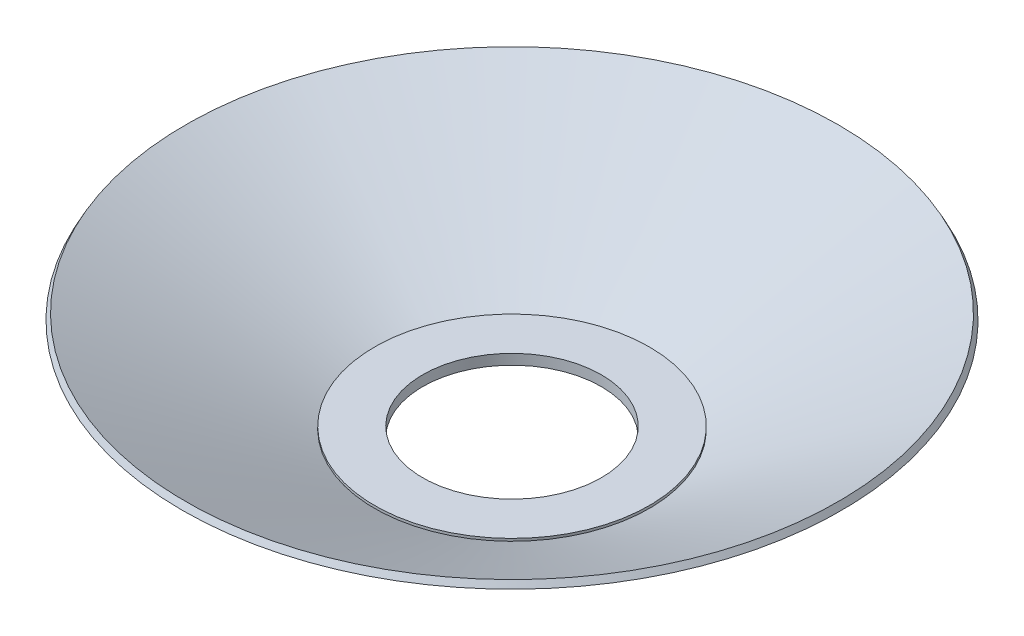
ISO-10303-21;
HEADER;
FILE_DESCRIPTION(('STEP AP214'),'2;1');
FILE_NAME('part.step','',(''),(''),'','','');
FILE_SCHEMA(('AUTOMOTIVE_DESIGN { 1 0 10303 214 1 1 1 1 }'));
ENDSEC;
DATA;
#1=APPLICATION_CONTEXT('core data for automotive mechanical design processes');
#2=APPLICATION_PROTOCOL_DEFINITION('international standard','automotive_design',2000,#1);
#3=PRODUCT_CONTEXT('',#1,'mechanical');
#4=PRODUCT('Part','Part','',(#3));
#5=PRODUCT_RELATED_PRODUCT_CATEGORY('part','',(#4));
#6=PRODUCT_DEFINITION_FORMATION('','',#4);
#7=PRODUCT_DEFINITION_CONTEXT('part definition',#1,'design');
#8=PRODUCT_DEFINITION('design','',#6,#7);
#9=PRODUCT_DEFINITION_SHAPE('','',#8);
#10=(LENGTH_UNIT() NAMED_UNIT(*) SI_UNIT(.MILLI.,.METRE.));
#11=(NAMED_UNIT(*) PLANE_ANGLE_UNIT() SI_UNIT($,.RADIAN.));
#12=(NAMED_UNIT(*) SI_UNIT($,.STERADIAN.) SOLID_ANGLE_UNIT());
#13=UNCERTAINTY_MEASURE_WITH_UNIT(LENGTH_MEASURE(1.E-05),#10,'distance_accuracy_value','');
#14=(GEOMETRIC_REPRESENTATION_CONTEXT(3) GLOBAL_UNCERTAINTY_ASSIGNED_CONTEXT((#13)) GLOBAL_UNIT_ASSIGNED_CONTEXT((#10,
#11,#12)) REPRESENTATION_CONTEXT('',''));
#15=CARTESIAN_POINT('',(0.,0.,0.));
#16=DIRECTION('',(0.,0.,1.));
#17=DIRECTION('',(1.,0.,0.));
#18=AXIS2_PLACEMENT_3D('',#15,#16,#17);
#19=CARTESIAN_POINT('',(0.,0.,0.));
#20=DIRECTION('',(0.,-1.,0.));
#21=DIRECTION('',(0.,0.,-1.));
#22=AXIS2_PLACEMENT_3D('',#19,#20,#21);
#23=CYLINDRICAL_SURFACE('',#22,20.);
#24=CARTESIAN_POINT('',(0.,0.,0.));
#25=DIRECTION('',(0.,-1.,0.));
#26=DIRECTION('',(0.,0.,-1.));
#27=AXIS2_PLACEMENT_3D('',#24,#25,#26);
#28=CIRCLE('',#27,20.);
#29=CARTESIAN_POINT('',(0.,0.,-20.));
#30=VERTEX_POINT('',#29);
#31=EDGE_CURVE('E59',#30,#30,#28,.T.);
#32=ORIENTED_EDGE('',*,*,#31,.T.);
#33=EDGE_LOOP('',(#32));
#34=FACE_BOUND('',#33,.T.);
#35=CARTESIAN_POINT('',(0.,-0.367429949310956,0.));
#36=DIRECTION('',(0.,-1.,0.));
#37=DIRECTION('',(0.,0.,-1.));
#38=AXIS2_PLACEMENT_3D('',#35,#36,#37);
#39=CIRCLE('',#38,20.);
#40=CARTESIAN_POINT('',(0.,-0.367429949310956,-20.));
#41=VERTEX_POINT('',#40);
#42=EDGE_CURVE('E10',#41,#41,#39,.T.);
#43=ORIENTED_EDGE('',*,*,#42,.F.);
#44=EDGE_LOOP('',(#43));
#45=FACE_BOUND('',#44,.T.);
#46=ADVANCED_FACE('F34',(#34,#45),#23,.T.);
#47=CARTESIAN_POINT('',(0.,14.2545794213797,0.));
#48=DIRECTION('',(0.,1.,0.));
#49=DIRECTION('',(0.,0.,1.));
#50=AXIS2_PLACEMENT_3D('',#47,#48,#49);
#51=CONICAL_SURFACE('',#50,47.5,1.08210413623648);
#52=ORIENTED_EDGE('',*,*,#42,.T.);
#53=EDGE_LOOP('',(#52));
#54=FACE_BOUND('',#53,.T.);
#55=CARTESIAN_POINT('',(0.,14.2545794213797,0.));
#56=DIRECTION('',(0.,-1.,0.));
#57=DIRECTION('',(0.,0.,-1.));
#58=AXIS2_PLACEMENT_3D('',#55,#56,#57);
#59=CIRCLE('',#58,47.5);
#60=CARTESIAN_POINT('',(0.,14.2545794213797,-47.5));
#61=VERTEX_POINT('',#60);
#62=EDGE_CURVE('E40',#61,#61,#59,.T.);
#63=ORIENTED_EDGE('',*,*,#62,.F.);
#64=EDGE_LOOP('',(#63));
#65=FACE_BOUND('',#64,.T.);
#66=ADVANCED_FACE('F77',(#54,#65),#51,.F.);
#67=CARTESIAN_POINT('',(0.,13.3716318285208,0.));
#68=DIRECTION('',(0.,-1.,0.));
#69=DIRECTION('',(0.,0.,-1.));
#70=AXIS2_PLACEMENT_3D('',#67,#68,#69);
#71=CONICAL_SURFACE('',#70,47.9694715627859,0.488692190558407);
#72=ORIENTED_EDGE('',*,*,#62,.T.);
#73=EDGE_LOOP('',(#72));
#74=FACE_BOUND('',#73,.T.);
#75=CARTESIAN_POINT('',(0.,13.3716318285208,0.));
#76=DIRECTION('',(0.,-1.,0.));
#77=DIRECTION('',(0.,0.,-1.));
#78=AXIS2_PLACEMENT_3D('',#75,#76,#77);
#79=CIRCLE('',#78,47.9694715627859);
#80=CARTESIAN_POINT('',(0.,13.3716318285208,-47.9694715627859));
#81=VERTEX_POINT('',#80);
#82=EDGE_CURVE('E44',#81,#81,#79,.T.);
#83=ORIENTED_EDGE('',*,*,#82,.F.);
#84=EDGE_LOOP('',(#83));
#85=FACE_BOUND('',#84,.T.);
#86=ADVANCED_FACE('F81',(#74,#85),#71,.T.);
#87=CARTESIAN_POINT('',(0.,-1.5,0.));
#88=DIRECTION('',(0.,1.,0.));
#89=DIRECTION('',(0.,0.,1.));
#90=AXIS2_PLACEMENT_3D('',#87,#88,#89);
#91=CONICAL_SURFACE('',#90,20.,1.08210413623648);
#92=ORIENTED_EDGE('',*,*,#82,.T.);
#93=EDGE_LOOP('',(#92));
#94=FACE_BOUND('',#93,.T.);
#95=CARTESIAN_POINT('',(0.,-1.5,0.));
#96=DIRECTION('',(0.,-1.,0.));
#97=DIRECTION('',(0.,0.,-1.));
#98=AXIS2_PLACEMENT_3D('',#95,#96,#97);
#99=CIRCLE('',#98,20.);
#100=CARTESIAN_POINT('',(0.,-1.5,-20.));
#101=VERTEX_POINT('',#100);
#102=EDGE_CURVE('E48',#101,#101,#99,.T.);
#103=ORIENTED_EDGE('',*,*,#102,.F.);
#104=EDGE_LOOP('',(#103));
#105=FACE_BOUND('',#104,.T.);
#106=ADVANCED_FACE('F85',(#94,#105),#91,.T.);
#107=CARTESIAN_POINT('',(20.,-1.5,0.));
#108=DIRECTION('',(0.,-1.,0.));
#109=DIRECTION('',(0.,0.,-1.));
#110=AXIS2_PLACEMENT_3D('',#107,#108,#109);
#111=PLANE('',#110);
#112=ORIENTED_EDGE('',*,*,#102,.T.);
#113=EDGE_LOOP('',(#112));
#114=FACE_BOUND('',#113,.T.);
#115=CARTESIAN_POINT('',(0.,-1.5,0.));
#116=DIRECTION('',(0.,-1.,0.));
#117=DIRECTION('',(0.,0.,-1.));
#118=AXIS2_PLACEMENT_3D('',#115,#116,#117);
#119=CIRCLE('',#118,13.);
#120=CARTESIAN_POINT('',(0.,-1.5,-13.));
#121=VERTEX_POINT('',#120);
#122=EDGE_CURVE('E53',#121,#121,#119,.T.);
#123=ORIENTED_EDGE('',*,*,#122,.F.);
#124=EDGE_LOOP('',(#123));
#125=FACE_BOUND('',#124,.T.);
#126=ADVANCED_FACE('F73',(#114,#125),#111,.T.);
#127=CARTESIAN_POINT('',(0.,0.,0.));
#128=DIRECTION('',(0.,-1.,0.));
#129=DIRECTION('',(0.,0.,-1.));
#130=AXIS2_PLACEMENT_3D('',#127,#128,#129);
#131=CYLINDRICAL_SURFACE('',#130,13.);
#132=ORIENTED_EDGE('',*,*,#122,.T.);
#133=EDGE_LOOP('',(#132));
#134=FACE_BOUND('',#133,.T.);
#135=CARTESIAN_POINT('',(0.,0.,0.));
#136=DIRECTION('',(0.,-1.,0.));
#137=DIRECTION('',(0.,0.,-1.));
#138=AXIS2_PLACEMENT_3D('',#135,#136,#137);
#139=CIRCLE('',#138,13.);
#140=CARTESIAN_POINT('',(0.,0.,-13.));
#141=VERTEX_POINT('',#140);
#142=EDGE_CURVE('E56',#141,#141,#139,.T.);
#143=ORIENTED_EDGE('',*,*,#142,.F.);
#144=EDGE_LOOP('',(#143));
#145=FACE_BOUND('',#144,.T.);
#146=ADVANCED_FACE('F67',(#134,#145),#131,.F.);
#147=CARTESIAN_POINT('',(13.,0.,0.));
#148=DIRECTION('',(0.,1.,0.));
#149=DIRECTION('',(0.,0.,1.));
#150=AXIS2_PLACEMENT_3D('',#147,#148,#149);
#151=PLANE('',#150);
#152=ORIENTED_EDGE('',*,*,#142,.T.);
#153=EDGE_LOOP('',(#152));
#154=FACE_BOUND('',#153,.T.);
#155=ORIENTED_EDGE('',*,*,#31,.F.);
#156=EDGE_LOOP('',(#155));
#157=FACE_BOUND('',#156,.T.);
#158=ADVANCED_FACE('F65',(#154,#157),#151,.T.);
#159=CLOSED_SHELL('',(#46,#66,#86,#106,#126,#146,#158));
#160=MANIFOLD_SOLID_BREP('B2',#159);
#161=ADVANCED_BREP_SHAPE_REPRESENTATION('',(#18,#160),#14);
#162=SHAPE_DEFINITION_REPRESENTATION(#9,#161);
ENDSEC;
END-ISO-10303-21;
